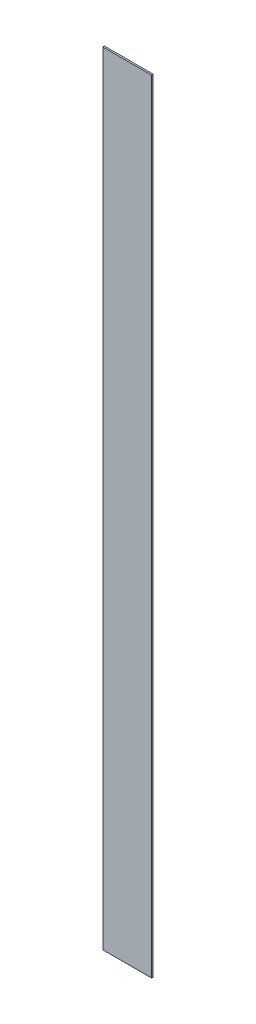
ISO-10303-21;
HEADER;
FILE_DESCRIPTION(('STEP AP214'),'2;1');
FILE_NAME('part.step','',(''),(''),'','','');
FILE_SCHEMA(('AUTOMOTIVE_DESIGN { 1 0 10303 214 1 1 1 1 }'));
ENDSEC;
DATA;
#1=APPLICATION_CONTEXT('core data for automotive mechanical design processes');
#2=APPLICATION_PROTOCOL_DEFINITION('international standard','automotive_design',2000,#1);
#3=PRODUCT_CONTEXT('',#1,'mechanical');
#4=PRODUCT('Part','Part','',(#3));
#5=PRODUCT_RELATED_PRODUCT_CATEGORY('part','',(#4));
#6=PRODUCT_DEFINITION_FORMATION('','',#4);
#7=PRODUCT_DEFINITION_CONTEXT('part definition',#1,'design');
#8=PRODUCT_DEFINITION('design','',#6,#7);
#9=PRODUCT_DEFINITION_SHAPE('','',#8);
#10=(LENGTH_UNIT() NAMED_UNIT(*) SI_UNIT(.MILLI.,.METRE.));
#11=(NAMED_UNIT(*) PLANE_ANGLE_UNIT() SI_UNIT($,.RADIAN.));
#12=(NAMED_UNIT(*) SI_UNIT($,.STERADIAN.) SOLID_ANGLE_UNIT());
#13=UNCERTAINTY_MEASURE_WITH_UNIT(LENGTH_MEASURE(1.E-05),#10,'distance_accuracy_value','');
#14=(GEOMETRIC_REPRESENTATION_CONTEXT(3) GLOBAL_UNCERTAINTY_ASSIGNED_CONTEXT((#13)) GLOBAL_UNIT_ASSIGNED_CONTEXT((#10,
#11,#12)) REPRESENTATION_CONTEXT('',''));
#15=CARTESIAN_POINT('',(0.,0.,0.));
#16=DIRECTION('',(0.,0.,1.));
#17=DIRECTION('',(1.,0.,0.));
#18=AXIS2_PLACEMENT_3D('',#15,#16,#17);
#19=CARTESIAN_POINT('',(37.4999999999999,600.,2.5));
#20=DIRECTION('',(-1.,0.,0.));
#21=DIRECTION('',(0.,-1.,0.));
#22=AXIS2_PLACEMENT_3D('',#19,#20,#21);
#23=PLANE('',#22);
#24=DIRECTION('',(0.,1.,0.));
#25=VECTOR('',#24,1.);
#26=CARTESIAN_POINT('',(37.4999999999999,600.,0.));
#27=LINE('',#26,#25);
#28=CARTESIAN_POINT('',(37.5000000000001,-600.,0.));
#29=VERTEX_POINT('',#28);
#30=CARTESIAN_POINT('',(37.4999999999999,600.,0.));
#31=VERTEX_POINT('',#30);
#32=EDGE_CURVE('E96',#29,#31,#27,.T.);
#33=ORIENTED_EDGE('',*,*,#32,.T.);
#34=DIRECTION('',(0.,0.,-1.));
#35=VECTOR('',#34,1.);
#36=CARTESIAN_POINT('',(37.4999999999999,600.,2.5));
#37=LINE('',#36,#35);
#38=CARTESIAN_POINT('',(37.4999999999999,600.,2.5));
#39=VERTEX_POINT('',#38);
#40=EDGE_CURVE('E11',#39,#31,#37,.T.);
#41=ORIENTED_EDGE('',*,*,#40,.F.);
#42=DIRECTION('',(0.,1.,0.));
#43=VECTOR('',#42,1.);
#44=CARTESIAN_POINT('',(37.4999999999999,600.,2.5));
#45=LINE('',#44,#43);
#46=CARTESIAN_POINT('',(37.5000000000001,-600.,2.5));
#47=VERTEX_POINT('',#46);
#48=EDGE_CURVE('E84',#47,#39,#45,.T.);
#49=ORIENTED_EDGE('',*,*,#48,.F.);
#50=DIRECTION('',(0.,0.,-1.));
#51=VECTOR('',#50,1.);
#52=CARTESIAN_POINT('',(37.5000000000001,-600.,2.5));
#53=LINE('',#52,#51);
#54=EDGE_CURVE('E92',#47,#29,#53,.T.);
#55=ORIENTED_EDGE('',*,*,#54,.T.);
#56=EDGE_LOOP('',(#33,#41,#49,#55));
#57=FACE_BOUND('',#56,.T.);
#58=ADVANCED_FACE('F33',(#57),#23,.F.);
#59=CARTESIAN_POINT('',(-37.5000000000001,600.,2.5));
#60=DIRECTION('',(0.,-1.,0.));
#61=DIRECTION('',(0.,0.,-1.));
#62=AXIS2_PLACEMENT_3D('',#59,#60,#61);
#63=PLANE('',#62);
#64=DIRECTION('',(-1.,0.,0.));
#65=VECTOR('',#64,1.);
#66=CARTESIAN_POINT('',(-37.5000000000001,600.,0.));
#67=LINE('',#66,#65);
#68=CARTESIAN_POINT('',(-37.5000000000001,600.,0.));
#69=VERTEX_POINT('',#68);
#70=EDGE_CURVE('E88',#31,#69,#67,.T.);
#71=ORIENTED_EDGE('',*,*,#70,.T.);
#72=DIRECTION('',(0.,0.,-1.));
#73=VECTOR('',#72,1.);
#74=CARTESIAN_POINT('',(-37.5000000000001,600.,2.5));
#75=LINE('',#74,#73);
#76=CARTESIAN_POINT('',(-37.5000000000001,600.,2.5));
#77=VERTEX_POINT('',#76);
#78=EDGE_CURVE('E41',#77,#69,#75,.T.);
#79=ORIENTED_EDGE('',*,*,#78,.F.);
#80=DIRECTION('',(-1.,0.,0.));
#81=VECTOR('',#80,1.);
#82=CARTESIAN_POINT('',(-37.5000000000001,600.,2.5));
#83=LINE('',#82,#81);
#84=EDGE_CURVE('E79',#39,#77,#83,.T.);
#85=ORIENTED_EDGE('',*,*,#84,.F.);
#86=ORIENTED_EDGE('',*,*,#40,.T.);
#87=EDGE_LOOP('',(#71,#79,#85,#86));
#88=FACE_BOUND('',#87,.T.);
#89=ADVANCED_FACE('F87',(#88),#63,.F.);
#90=CARTESIAN_POINT('',(-37.5000000000001,600.,2.5));
#91=DIRECTION('',(1.,0.,0.));
#92=DIRECTION('',(0.,1.,0.));
#93=AXIS2_PLACEMENT_3D('',#90,#91,#92);
#94=PLANE('',#93);
#95=DIRECTION('',(0.,-1.,0.));
#96=VECTOR('',#95,1.);
#97=CARTESIAN_POINT('',(-37.5000000000001,600.,0.));
#98=LINE('',#97,#96);
#99=CARTESIAN_POINT('',(-37.4999999999999,-600.,0.));
#100=VERTEX_POINT('',#99);
#101=EDGE_CURVE('E66',#69,#100,#98,.T.);
#102=ORIENTED_EDGE('',*,*,#101,.T.);
#103=DIRECTION('',(0.,0.,-1.));
#104=VECTOR('',#103,1.);
#105=CARTESIAN_POINT('',(-37.4999999999999,-600.,2.5));
#106=LINE('',#105,#104);
#107=CARTESIAN_POINT('',(-37.4999999999999,-600.,2.5));
#108=VERTEX_POINT('',#107);
#109=EDGE_CURVE('E89',#108,#100,#106,.T.);
#110=ORIENTED_EDGE('',*,*,#109,.F.);
#111=DIRECTION('',(0.,-1.,0.));
#112=VECTOR('',#111,1.);
#113=CARTESIAN_POINT('',(-37.5000000000001,600.,2.5));
#114=LINE('',#113,#112);
#115=EDGE_CURVE('E82',#77,#108,#114,.T.);
#116=ORIENTED_EDGE('',*,*,#115,.F.);
#117=ORIENTED_EDGE('',*,*,#78,.T.);
#118=EDGE_LOOP('',(#102,#110,#116,#117));
#119=FACE_BOUND('',#118,.T.);
#120=ADVANCED_FACE('F90',(#119),#94,.F.);
#121=CARTESIAN_POINT('',(-37.4999999999999,-600.,2.5));
#122=DIRECTION('',(0.,1.,0.));
#123=DIRECTION('',(0.,0.,1.));
#124=AXIS2_PLACEMENT_3D('',#121,#122,#123);
#125=PLANE('',#124);
#126=DIRECTION('',(1.,0.,0.));
#127=VECTOR('',#126,1.);
#128=CARTESIAN_POINT('',(-37.4999999999999,-600.,0.));
#129=LINE('',#128,#127);
#130=EDGE_CURVE('E72',#100,#29,#129,.T.);
#131=ORIENTED_EDGE('',*,*,#130,.T.);
#132=ORIENTED_EDGE('',*,*,#54,.F.);
#133=DIRECTION('',(1.,0.,0.));
#134=VECTOR('',#133,1.);
#135=CARTESIAN_POINT('',(-37.4999999999999,-600.,2.5));
#136=LINE('',#135,#134);
#137=EDGE_CURVE('E49',#108,#47,#136,.T.);
#138=ORIENTED_EDGE('',*,*,#137,.F.);
#139=ORIENTED_EDGE('',*,*,#109,.T.);
#140=EDGE_LOOP('',(#131,#132,#138,#139));
#141=FACE_BOUND('',#140,.T.);
#142=ADVANCED_FACE('F103',(#141),#125,.F.);
#143=CARTESIAN_POINT('',(0.,0.,2.5));
#144=DIRECTION('',(0.,0.,1.));
#145=DIRECTION('',(1.,0.,0.));
#146=AXIS2_PLACEMENT_3D('',#143,#144,#145);
#147=PLANE('',#146);
#148=ORIENTED_EDGE('',*,*,#48,.T.);
#149=ORIENTED_EDGE('',*,*,#84,.T.);
#150=ORIENTED_EDGE('',*,*,#115,.T.);
#151=ORIENTED_EDGE('',*,*,#137,.T.);
#152=EDGE_LOOP('',(#148,#149,#150,#151));
#153=FACE_BOUND('',#152,.T.);
#154=ADVANCED_FACE('F80',(#153),#147,.T.);
#155=CARTESIAN_POINT('',(0.,0.,0.));
#156=DIRECTION('',(0.,0.,1.));
#157=DIRECTION('',(1.,0.,0.));
#158=AXIS2_PLACEMENT_3D('',#155,#156,#157);
#159=PLANE('',#158);
#160=ORIENTED_EDGE('',*,*,#32,.F.);
#161=ORIENTED_EDGE('',*,*,#130,.F.);
#162=ORIENTED_EDGE('',*,*,#101,.F.);
#163=ORIENTED_EDGE('',*,*,#70,.F.);
#164=EDGE_LOOP('',(#160,#161,#162,#163));
#165=FACE_BOUND('',#164,.T.);
#166=ADVANCED_FACE('F106',(#165),#159,.F.);
#167=CLOSED_SHELL('',(#58,#89,#120,#142,#154,#166));
#168=MANIFOLD_SOLID_BREP('B2',#167);
#169=ADVANCED_BREP_SHAPE_REPRESENTATION('',(#18,#168),#14);
#170=SHAPE_DEFINITION_REPRESENTATION(#9,#169);
ENDSEC;
END-ISO-10303-21;
